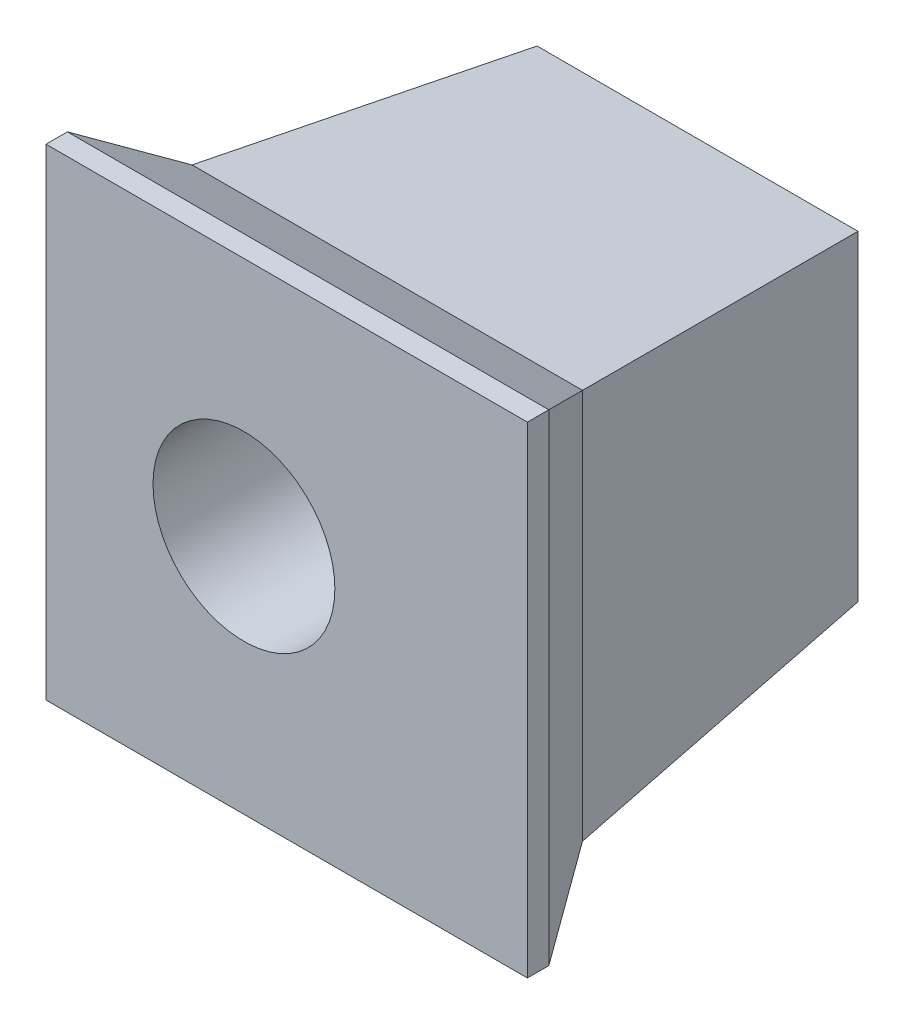
ISO-10303-21;
HEADER;
FILE_DESCRIPTION(('STEP AP214'),'2;1');
FILE_NAME('part.step','',(''),(''),'','','');
FILE_SCHEMA(('AUTOMOTIVE_DESIGN { 1 0 10303 214 1 1 1 1 }'));
ENDSEC;
DATA;
#1=APPLICATION_CONTEXT('core data for automotive mechanical design processes');
#2=APPLICATION_PROTOCOL_DEFINITION('international standard','automotive_design',2000,#1);
#3=PRODUCT_CONTEXT('',#1,'mechanical');
#4=PRODUCT('Part','Part','',(#3));
#5=PRODUCT_RELATED_PRODUCT_CATEGORY('part','',(#4));
#6=PRODUCT_DEFINITION_FORMATION('','',#4);
#7=PRODUCT_DEFINITION_CONTEXT('part definition',#1,'design');
#8=PRODUCT_DEFINITION('design','',#6,#7);
#9=PRODUCT_DEFINITION_SHAPE('','',#8);
#10=(LENGTH_UNIT() NAMED_UNIT(*) SI_UNIT(.MILLI.,.METRE.));
#11=(NAMED_UNIT(*) PLANE_ANGLE_UNIT() SI_UNIT($,.RADIAN.));
#12=(NAMED_UNIT(*) SI_UNIT($,.STERADIAN.) SOLID_ANGLE_UNIT());
#13=UNCERTAINTY_MEASURE_WITH_UNIT(LENGTH_MEASURE(1.E-05),#10,'distance_accuracy_value','');
#14=(GEOMETRIC_REPRESENTATION_CONTEXT(3) GLOBAL_UNCERTAINTY_ASSIGNED_CONTEXT((#13)) GLOBAL_UNIT_ASSIGNED_CONTEXT((#10,
#11,#12)) REPRESENTATION_CONTEXT('',''));
#15=CARTESIAN_POINT('',(0.,0.,0.));
#16=DIRECTION('',(0.,0.,1.));
#17=DIRECTION('',(1.,0.,0.));
#18=AXIS2_PLACEMENT_3D('',#15,#16,#17);
#19=CARTESIAN_POINT('',(0.,13.7233684644169,-7.88166432077999));
#20=DIRECTION('',(0.,-0.867159382876363,0.498030726651966));
#21=DIRECTION('',(0.,-0.498030726651966,-0.867159382876363));
#22=AXIS2_PLACEMENT_3D('',#19,#20,#21);
#23=PLANE('',#22);
#24=DIRECTION('',(-0.445802833261553,0.445802833261554,0.776221403796586));
#25=VECTOR('',#24,1.);
#26=CARTESIAN_POINT('',(-18.25,18.25,0.));
#27=LINE('',#26,#25);
#28=CARTESIAN_POINT('',(-18.25,18.25,0.));
#29=VERTEX_POINT('',#28);
#30=CARTESIAN_POINT('',(-22.5,22.5,7.4));
#31=VERTEX_POINT('',#30);
#32=EDGE_CURVE('E375',#29,#31,#27,.T.);
#33=ORIENTED_EDGE('',*,*,#32,.T.);
#34=DIRECTION('',(-1.,0.,0.));
#35=VECTOR('',#34,1.);
#36=CARTESIAN_POINT('',(-22.5,22.5,7.4));
#37=LINE('',#36,#35);
#38=CARTESIAN_POINT('',(22.5,22.5,7.4));
#39=VERTEX_POINT('',#38);
#40=EDGE_CURVE('E12',#39,#31,#37,.T.);
#41=ORIENTED_EDGE('',*,*,#40,.F.);
#42=DIRECTION('',(0.445802833261553,0.445802833261554,0.776221403796586));
#43=VECTOR('',#42,1.);
#44=CARTESIAN_POINT('',(18.25,18.25,0.));
#45=LINE('',#44,#43);
#46=CARTESIAN_POINT('',(18.25,18.25,0.));
#47=VERTEX_POINT('',#46);
#48=EDGE_CURVE('E70',#47,#39,#45,.T.);
#49=ORIENTED_EDGE('',*,*,#48,.F.);
#50=DIRECTION('',(-1.,0.,0.));
#51=VECTOR('',#50,1.);
#52=CARTESIAN_POINT('',(-18.25,18.25,0.));
#53=LINE('',#52,#51);
#54=EDGE_CURVE('E264',#47,#29,#53,.T.);
#55=ORIENTED_EDGE('',*,*,#54,.T.);
#56=EDGE_LOOP('',(#33,#41,#49,#55));
#57=FACE_BOUND('',#56,.T.);
#58=ADVANCED_FACE('F51',(#57),#23,.F.);
#59=CARTESIAN_POINT('',(13.7233684644169,0.,-7.88166432077998));
#60=DIRECTION('',(-0.867159382876363,0.,0.498030726651965));
#61=DIRECTION('',(0.498030726651966,0.,0.867159382876363));
#62=AXIS2_PLACEMENT_3D('',#59,#60,#61);
#63=PLANE('',#62);
#64=ORIENTED_EDGE('',*,*,#48,.T.);
#65=DIRECTION('',(0.,1.,0.));
#66=VECTOR('',#65,1.);
#67=CARTESIAN_POINT('',(22.5,22.5,7.4));
#68=LINE('',#67,#66);
#69=CARTESIAN_POINT('',(22.5,-22.5,7.4));
#70=VERTEX_POINT('',#69);
#71=EDGE_CURVE('E56',#70,#39,#68,.T.);
#72=ORIENTED_EDGE('',*,*,#71,.F.);
#73=DIRECTION('',(0.445802833261553,-0.445802833261553,0.776221403796587));
#74=VECTOR('',#73,1.);
#75=CARTESIAN_POINT('',(18.25,-18.25,0.));
#76=LINE('',#75,#74);
#77=CARTESIAN_POINT('',(18.25,-18.25,0.));
#78=VERTEX_POINT('',#77);
#79=EDGE_CURVE('E349',#78,#70,#76,.T.);
#80=ORIENTED_EDGE('',*,*,#79,.F.);
#81=DIRECTION('',(0.,1.,0.));
#82=VECTOR('',#81,1.);
#83=CARTESIAN_POINT('',(18.25,18.25,0.));
#84=LINE('',#83,#82);
#85=EDGE_CURVE('E265',#78,#47,#84,.T.);
#86=ORIENTED_EDGE('',*,*,#85,.T.);
#87=EDGE_LOOP('',(#64,#72,#80,#86));
#88=FACE_BOUND('',#87,.T.);
#89=ADVANCED_FACE('F312',(#88),#63,.F.);
#90=CARTESIAN_POINT('',(-13.7233684644169,0.,-7.88166432077997));
#91=DIRECTION('',(0.867159382876364,0.,0.498030726651965));
#92=DIRECTION('',(0.498030726651965,0.,-0.867159382876364));
#93=AXIS2_PLACEMENT_3D('',#90,#91,#92);
#94=PLANE('',#93);
#95=DIRECTION('',(-0.445802833261553,-0.445802833261553,0.776221403796587));
#96=VECTOR('',#95,1.);
#97=CARTESIAN_POINT('',(-18.25,-18.25,0.));
#98=LINE('',#97,#96);
#99=CARTESIAN_POINT('',(-18.25,-18.25,0.));
#100=VERTEX_POINT('',#99);
#101=CARTESIAN_POINT('',(-22.5,-22.5,7.4));
#102=VERTEX_POINT('',#101);
#103=EDGE_CURVE('E345',#100,#102,#98,.T.);
#104=ORIENTED_EDGE('',*,*,#103,.T.);
#105=DIRECTION('',(0.,-1.,0.));
#106=VECTOR('',#105,1.);
#107=CARTESIAN_POINT('',(-22.5,22.5,7.4));
#108=LINE('',#107,#106);
#109=EDGE_CURVE('E62',#31,#102,#108,.T.);
#110=ORIENTED_EDGE('',*,*,#109,.F.);
#111=ORIENTED_EDGE('',*,*,#32,.F.);
#112=DIRECTION('',(0.,-1.,0.));
#113=VECTOR('',#112,1.);
#114=CARTESIAN_POINT('',(-18.25,18.25,0.));
#115=LINE('',#114,#113);
#116=EDGE_CURVE('E347',#29,#100,#115,.T.);
#117=ORIENTED_EDGE('',*,*,#116,.T.);
#118=EDGE_LOOP('',(#104,#110,#111,#117));
#119=FACE_BOUND('',#118,.T.);
#120=ADVANCED_FACE('F330',(#119),#94,.F.);
#121=CARTESIAN_POINT('',(0.,-13.7233684644169,-7.88166432077997));
#122=DIRECTION('',(0.,0.867159382876364,0.498030726651965));
#123=DIRECTION('',(0.,-0.498030726651965,0.867159382876364));
#124=AXIS2_PLACEMENT_3D('',#121,#122,#123);
#125=PLANE('',#124);
#126=ORIENTED_EDGE('',*,*,#79,.T.);
#127=DIRECTION('',(1.,0.,0.));
#128=VECTOR('',#127,1.);
#129=CARTESIAN_POINT('',(-22.5,-22.5,7.4));
#130=LINE('',#129,#128);
#131=EDGE_CURVE('E149',#102,#70,#130,.T.);
#132=ORIENTED_EDGE('',*,*,#131,.F.);
#133=ORIENTED_EDGE('',*,*,#103,.F.);
#134=DIRECTION('',(1.,0.,0.));
#135=VECTOR('',#134,1.);
#136=CARTESIAN_POINT('',(-18.25,-18.25,0.));
#137=LINE('',#136,#135);
#138=EDGE_CURVE('E267',#100,#78,#137,.T.);
#139=ORIENTED_EDGE('',*,*,#138,.T.);
#140=EDGE_LOOP('',(#126,#132,#133,#139));
#141=FACE_BOUND('',#140,.T.);
#142=ADVANCED_FACE('F53',(#141),#125,.F.);
#143=CARTESIAN_POINT('',(0.,0.,-29.));
#144=DIRECTION('',(0.,0.,-1.));
#145=DIRECTION('',(-1.,0.,0.));
#146=AXIS2_PLACEMENT_3D('',#143,#144,#145);
#147=PLANE('',#146);
#148=CARTESIAN_POINT('',(-4.,0.,-29.));
#149=DIRECTION('',(0.,0.,-1.));
#150=DIRECTION('',(-1.,0.,0.));
#151=AXIS2_PLACEMENT_3D('',#148,#149,#150);
#152=CIRCLE('',#151,3.);
#153=CARTESIAN_POINT('',(-7.,0.,-29.));
#154=VERTEX_POINT('',#153);
#155=EDGE_CURVE('E154',#154,#154,#152,.T.);
#156=ORIENTED_EDGE('',*,*,#155,.F.);
#157=EDGE_LOOP('',(#156));
#158=FACE_BOUND('',#157,.T.);
#159=DIRECTION('',(0.,1.,0.));
#160=VECTOR('',#159,1.);
#161=CARTESIAN_POINT('',(-15.,15.,-29.));
#162=LINE('',#161,#160);
#163=CARTESIAN_POINT('',(-15.,-15.,-29.));
#164=VERTEX_POINT('',#163);
#165=CARTESIAN_POINT('',(-15.,15.,-29.));
#166=VERTEX_POINT('',#165);
#167=EDGE_CURVE('E229',#164,#166,#162,.T.);
#168=ORIENTED_EDGE('',*,*,#167,.T.);
#169=DIRECTION('',(1.,0.,0.));
#170=VECTOR('',#169,1.);
#171=CARTESIAN_POINT('',(15.,15.,-29.));
#172=LINE('',#171,#170);
#173=CARTESIAN_POINT('',(15.,15.,-29.));
#174=VERTEX_POINT('',#173);
#175=EDGE_CURVE('E232',#166,#174,#172,.T.);
#176=ORIENTED_EDGE('',*,*,#175,.T.);
#177=DIRECTION('',(0.,-1.,0.));
#178=VECTOR('',#177,1.);
#179=CARTESIAN_POINT('',(15.,15.,-29.));
#180=LINE('',#179,#178);
#181=CARTESIAN_POINT('',(15.,-15.,-29.));
#182=VERTEX_POINT('',#181);
#183=EDGE_CURVE('E228',#174,#182,#180,.T.);
#184=ORIENTED_EDGE('',*,*,#183,.T.);
#185=DIRECTION('',(-1.,0.,0.));
#186=VECTOR('',#185,1.);
#187=CARTESIAN_POINT('',(15.,-15.,-29.));
#188=LINE('',#187,#186);
#189=EDGE_CURVE('E221',#182,#164,#188,.T.);
#190=ORIENTED_EDGE('',*,*,#189,.T.);
#191=EDGE_LOOP('',(#168,#176,#184,#190));
#192=FACE_BOUND('',#191,.T.);
#193=ADVANCED_FACE('F193',(#158,#192),#147,.T.);
#194=CARTESIAN_POINT('',(-18.0236330275229,0.,-2.01988990825688));
#195=DIRECTION('',(0.993778813557237,0.,0.111371763588311));
#196=DIRECTION('',(0.111371763588311,0.,-0.993778813557237));
#197=AXIS2_PLACEMENT_3D('',#194,#195,#196);
#198=PLANE('',#197);
#199=DIRECTION('',(-0.110687414096018,-0.110687414096018,0.987672310395241));
#200=VECTOR('',#199,1.);
#201=CARTESIAN_POINT('',(-15.,-15.,-29.));
#202=LINE('',#201,#200);
#203=EDGE_CURVE('E236',#164,#100,#202,.T.);
#204=ORIENTED_EDGE('',*,*,#203,.T.);
#205=ORIENTED_EDGE('',*,*,#116,.F.);
#206=DIRECTION('',(-0.110687414096019,0.110687414096018,0.987672310395241));
#207=VECTOR('',#206,1.);
#208=CARTESIAN_POINT('',(-15.,15.,-29.));
#209=LINE('',#208,#207);
#210=EDGE_CURVE('E269',#166,#29,#209,.T.);
#211=ORIENTED_EDGE('',*,*,#210,.F.);
#212=ORIENTED_EDGE('',*,*,#167,.F.);
#213=EDGE_LOOP('',(#204,#205,#211,#212));
#214=FACE_BOUND('',#213,.T.);
#215=ADVANCED_FACE('F197',(#214),#198,.F.);
#216=CARTESIAN_POINT('',(0.,18.0236330275229,-2.01988990825688));
#217=DIRECTION('',(0.,-0.993778813557237,0.111371763588311));
#218=DIRECTION('',(0.,-0.111371763588311,-0.993778813557237));
#219=AXIS2_PLACEMENT_3D('',#216,#217,#218);
#220=PLANE('',#219);
#221=ORIENTED_EDGE('',*,*,#210,.T.);
#222=ORIENTED_EDGE('',*,*,#54,.F.);
#223=DIRECTION('',(0.110687414096018,0.110687414096018,0.987672310395241));
#224=VECTOR('',#223,1.);
#225=CARTESIAN_POINT('',(15.,15.,-29.));
#226=LINE('',#225,#224);
#227=EDGE_CURVE('E257',#174,#47,#226,.T.);
#228=ORIENTED_EDGE('',*,*,#227,.F.);
#229=ORIENTED_EDGE('',*,*,#175,.F.);
#230=EDGE_LOOP('',(#221,#222,#228,#229));
#231=FACE_BOUND('',#230,.T.);
#232=ADVANCED_FACE('F262',(#231),#220,.F.);
#233=CARTESIAN_POINT('',(0.,-18.0236330275229,-2.01988990825688));
#234=DIRECTION('',(0.,0.993778813557237,0.111371763588311));
#235=DIRECTION('',(0.,-0.111371763588311,0.993778813557237));
#236=AXIS2_PLACEMENT_3D('',#233,#234,#235);
#237=PLANE('',#236);
#238=DIRECTION('',(0.110687414096018,-0.110687414096018,0.987672310395241));
#239=VECTOR('',#238,1.);
#240=CARTESIAN_POINT('',(15.,-15.,-29.));
#241=LINE('',#240,#239);
#242=EDGE_CURVE('E260',#182,#78,#241,.T.);
#243=ORIENTED_EDGE('',*,*,#242,.T.);
#244=ORIENTED_EDGE('',*,*,#138,.F.);
#245=ORIENTED_EDGE('',*,*,#203,.F.);
#246=ORIENTED_EDGE('',*,*,#189,.F.);
#247=EDGE_LOOP('',(#243,#244,#245,#246));
#248=FACE_BOUND('',#247,.T.);
#249=ADVANCED_FACE('F297',(#248),#237,.F.);
#250=CARTESIAN_POINT('',(18.0236330275229,0.,-2.01988990825688));
#251=DIRECTION('',(-0.993778813557237,0.,0.111371763588311));
#252=DIRECTION('',(0.111371763588311,0.,0.993778813557237));
#253=AXIS2_PLACEMENT_3D('',#250,#251,#252);
#254=PLANE('',#253);
#255=ORIENTED_EDGE('',*,*,#227,.T.);
#256=ORIENTED_EDGE('',*,*,#85,.F.);
#257=ORIENTED_EDGE('',*,*,#242,.F.);
#258=ORIENTED_EDGE('',*,*,#183,.F.);
#259=EDGE_LOOP('',(#255,#256,#257,#258));
#260=FACE_BOUND('',#259,.T.);
#261=ADVANCED_FACE('F191',(#260),#254,.F.);
#262=CARTESIAN_POINT('',(-4.,0.,-26.));
#263=DIRECTION('',(0.,0.,1.));
#264=DIRECTION('',(1.,0.,0.));
#265=AXIS2_PLACEMENT_3D('',#262,#263,#264);
#266=CYLINDRICAL_SURFACE('',#265,8.5);
#267=CARTESIAN_POINT('',(-4.,0.,-26.));
#268=DIRECTION('',(0.,0.,1.));
#269=DIRECTION('',(1.,0.,0.));
#270=AXIS2_PLACEMENT_3D('',#267,#268,#269);
#271=CIRCLE('',#270,8.5);
#272=CARTESIAN_POINT('',(4.5,0.,-26.));
#273=VERTEX_POINT('',#272);
#274=EDGE_CURVE('E245',#273,#273,#271,.T.);
#275=ORIENTED_EDGE('',*,*,#274,.F.);
#276=EDGE_LOOP('',(#275));
#277=FACE_BOUND('',#276,.T.);
#278=CARTESIAN_POINT('',(-4.,0.,9.4));
#279=DIRECTION('',(0.,0.,1.));
#280=DIRECTION('',(1.,0.,0.));
#281=AXIS2_PLACEMENT_3D('',#278,#279,#280);
#282=CIRCLE('',#281,8.5);
#283=CARTESIAN_POINT('',(4.5,0.,9.4));
#284=VERTEX_POINT('',#283);
#285=EDGE_CURVE('E146',#284,#284,#282,.T.);
#286=ORIENTED_EDGE('',*,*,#285,.T.);
#287=EDGE_LOOP('',(#286));
#288=FACE_BOUND('',#287,.T.);
#289=ADVANCED_FACE('F187',(#277,#288),#266,.F.);
#290=CARTESIAN_POINT('',(-4.,0.,-26.));
#291=DIRECTION('',(0.,0.,1.));
#292=DIRECTION('',(1.,0.,0.));
#293=AXIS2_PLACEMENT_3D('',#290,#291,#292);
#294=PLANE('',#293);
#295=CARTESIAN_POINT('',(-4.,0.,-26.));
#296=DIRECTION('',(0.,0.,1.));
#297=DIRECTION('',(1.,0.,0.));
#298=AXIS2_PLACEMENT_3D('',#295,#296,#297);
#299=CIRCLE('',#298,3.);
#300=CARTESIAN_POINT('',(-0.999999999999998,0.,-26.));
#301=VERTEX_POINT('',#300);
#302=EDGE_CURVE('E151',#301,#301,#299,.T.);
#303=ORIENTED_EDGE('',*,*,#302,.F.);
#304=EDGE_LOOP('',(#303));
#305=FACE_BOUND('',#304,.T.);
#306=ORIENTED_EDGE('',*,*,#274,.T.);
#307=EDGE_LOOP('',(#306));
#308=FACE_BOUND('',#307,.T.);
#309=ADVANCED_FACE('F183',(#305,#308),#294,.T.);
#310=CARTESIAN_POINT('',(-4.,0.,-59.4));
#311=DIRECTION('',(0.,0.,1.));
#312=DIRECTION('',(1.,0.,0.));
#313=AXIS2_PLACEMENT_3D('',#310,#311,#312);
#314=CYLINDRICAL_SURFACE('',#313,3.);
#315=ORIENTED_EDGE('',*,*,#155,.T.);
#316=EDGE_LOOP('',(#315));
#317=FACE_BOUND('',#316,.T.);
#318=ORIENTED_EDGE('',*,*,#302,.T.);
#319=EDGE_LOOP('',(#318));
#320=FACE_BOUND('',#319,.T.);
#321=ADVANCED_FACE('F180',(#317,#320),#314,.F.);
#322=CARTESIAN_POINT('',(0.,0.,9.4));
#323=DIRECTION('',(0.,0.,1.));
#324=DIRECTION('',(1.,0.,0.));
#325=AXIS2_PLACEMENT_3D('',#322,#323,#324);
#326=PLANE('',#325);
#327=DIRECTION('',(1.,0.,0.));
#328=VECTOR('',#327,1.);
#329=CARTESIAN_POINT('',(-22.5,-22.5,9.4));
#330=LINE('',#329,#328);
#331=CARTESIAN_POINT('',(-22.5,-22.5,9.4));
#332=VERTEX_POINT('',#331);
#333=CARTESIAN_POINT('',(22.5,-22.5,9.4));
#334=VERTEX_POINT('',#333);
#335=EDGE_CURVE('E136',#332,#334,#330,.T.);
#336=ORIENTED_EDGE('',*,*,#335,.T.);
#337=DIRECTION('',(0.,1.,0.));
#338=VECTOR('',#337,1.);
#339=CARTESIAN_POINT('',(22.5,-22.5,9.4));
#340=LINE('',#339,#338);
#341=CARTESIAN_POINT('',(22.5,22.5,9.4));
#342=VERTEX_POINT('',#341);
#343=EDGE_CURVE('E124',#334,#342,#340,.T.);
#344=ORIENTED_EDGE('',*,*,#343,.T.);
#345=DIRECTION('',(-1.,0.,0.));
#346=VECTOR('',#345,1.);
#347=CARTESIAN_POINT('',(22.5,22.5,9.4));
#348=LINE('',#347,#346);
#349=CARTESIAN_POINT('',(-22.5,22.5,9.4));
#350=VERTEX_POINT('',#349);
#351=EDGE_CURVE('E135',#342,#350,#348,.T.);
#352=ORIENTED_EDGE('',*,*,#351,.T.);
#353=DIRECTION('',(0.,-1.,0.));
#354=VECTOR('',#353,1.);
#355=CARTESIAN_POINT('',(-22.5,22.5,9.4));
#356=LINE('',#355,#354);
#357=EDGE_CURVE('E142',#350,#332,#356,.T.);
#358=ORIENTED_EDGE('',*,*,#357,.T.);
#359=EDGE_LOOP('',(#336,#344,#352,#358));
#360=FACE_BOUND('',#359,.T.);
#361=ORIENTED_EDGE('',*,*,#285,.F.);
#362=EDGE_LOOP('',(#361));
#363=FACE_BOUND('',#362,.T.);
#364=ADVANCED_FACE('F139',(#360,#363),#326,.T.);
#365=CARTESIAN_POINT('',(-22.5,-22.5,9.4));
#366=DIRECTION('',(0.,1.,0.));
#367=DIRECTION('',(0.,0.,1.));
#368=AXIS2_PLACEMENT_3D('',#365,#366,#367);
#369=PLANE('',#368);
#370=ORIENTED_EDGE('',*,*,#131,.T.);
#371=DIRECTION('',(0.,0.,-1.));
#372=VECTOR('',#371,1.);
#373=CARTESIAN_POINT('',(22.5,-22.5,9.4));
#374=LINE('',#373,#372);
#375=EDGE_CURVE('E129',#334,#70,#374,.T.);
#376=ORIENTED_EDGE('',*,*,#375,.F.);
#377=ORIENTED_EDGE('',*,*,#335,.F.);
#378=DIRECTION('',(0.,0.,-1.));
#379=VECTOR('',#378,1.);
#380=CARTESIAN_POINT('',(-22.5,-22.5,9.4));
#381=LINE('',#380,#379);
#382=EDGE_CURVE('E355',#332,#102,#381,.T.);
#383=ORIENTED_EDGE('',*,*,#382,.T.);
#384=EDGE_LOOP('',(#370,#376,#377,#383));
#385=FACE_BOUND('',#384,.T.);
#386=ADVANCED_FACE('F148',(#385),#369,.F.);
#387=CARTESIAN_POINT('',(22.5,-22.5,9.4));
#388=DIRECTION('',(-1.,0.,0.));
#389=DIRECTION('',(0.,-1.,0.));
#390=AXIS2_PLACEMENT_3D('',#387,#388,#389);
#391=PLANE('',#390);
#392=ORIENTED_EDGE('',*,*,#71,.T.);
#393=DIRECTION('',(0.,0.,-1.));
#394=VECTOR('',#393,1.);
#395=CARTESIAN_POINT('',(22.5,22.5,9.4));
#396=LINE('',#395,#394);
#397=EDGE_CURVE('E132',#342,#39,#396,.T.);
#398=ORIENTED_EDGE('',*,*,#397,.F.);
#399=ORIENTED_EDGE('',*,*,#343,.F.);
#400=ORIENTED_EDGE('',*,*,#375,.T.);
#401=EDGE_LOOP('',(#392,#398,#399,#400));
#402=FACE_BOUND('',#401,.T.);
#403=ADVANCED_FACE('F127',(#402),#391,.F.);
#404=CARTESIAN_POINT('',(22.5,22.5,9.4));
#405=DIRECTION('',(0.,-1.,0.));
#406=DIRECTION('',(0.,0.,-1.));
#407=AXIS2_PLACEMENT_3D('',#404,#405,#406);
#408=PLANE('',#407);
#409=ORIENTED_EDGE('',*,*,#40,.T.);
#410=DIRECTION('',(0.,0.,-1.));
#411=VECTOR('',#410,1.);
#412=CARTESIAN_POINT('',(-22.5,22.5,9.4));
#413=LINE('',#412,#411);
#414=EDGE_CURVE('E156',#350,#31,#413,.T.);
#415=ORIENTED_EDGE('',*,*,#414,.F.);
#416=ORIENTED_EDGE('',*,*,#351,.F.);
#417=ORIENTED_EDGE('',*,*,#397,.T.);
#418=EDGE_LOOP('',(#409,#415,#416,#417));
#419=FACE_BOUND('',#418,.T.);
#420=ADVANCED_FACE('F407',(#419),#408,.F.);
#421=CARTESIAN_POINT('',(-22.5,22.5,9.4));
#422=DIRECTION('',(1.,0.,0.));
#423=DIRECTION('',(0.,1.,0.));
#424=AXIS2_PLACEMENT_3D('',#421,#422,#423);
#425=PLANE('',#424);
#426=ORIENTED_EDGE('',*,*,#109,.T.);
#427=ORIENTED_EDGE('',*,*,#382,.F.);
#428=ORIENTED_EDGE('',*,*,#357,.F.);
#429=ORIENTED_EDGE('',*,*,#414,.T.);
#430=EDGE_LOOP('',(#426,#427,#428,#429));
#431=FACE_BOUND('',#430,.T.);
#432=ADVANCED_FACE('F354',(#431),#425,.F.);
#433=CLOSED_SHELL('',(#58,#89,#120,#142,#193,#215,#232,#249,#261,#289,#309,#321,#364,#386,#403,
#420,#432));
#434=MANIFOLD_SOLID_BREP('B2',#433);
#435=ADVANCED_BREP_SHAPE_REPRESENTATION('',(#18,#434),#14);
#436=SHAPE_DEFINITION_REPRESENTATION(#9,#435);
ENDSEC;
END-ISO-10303-21;
